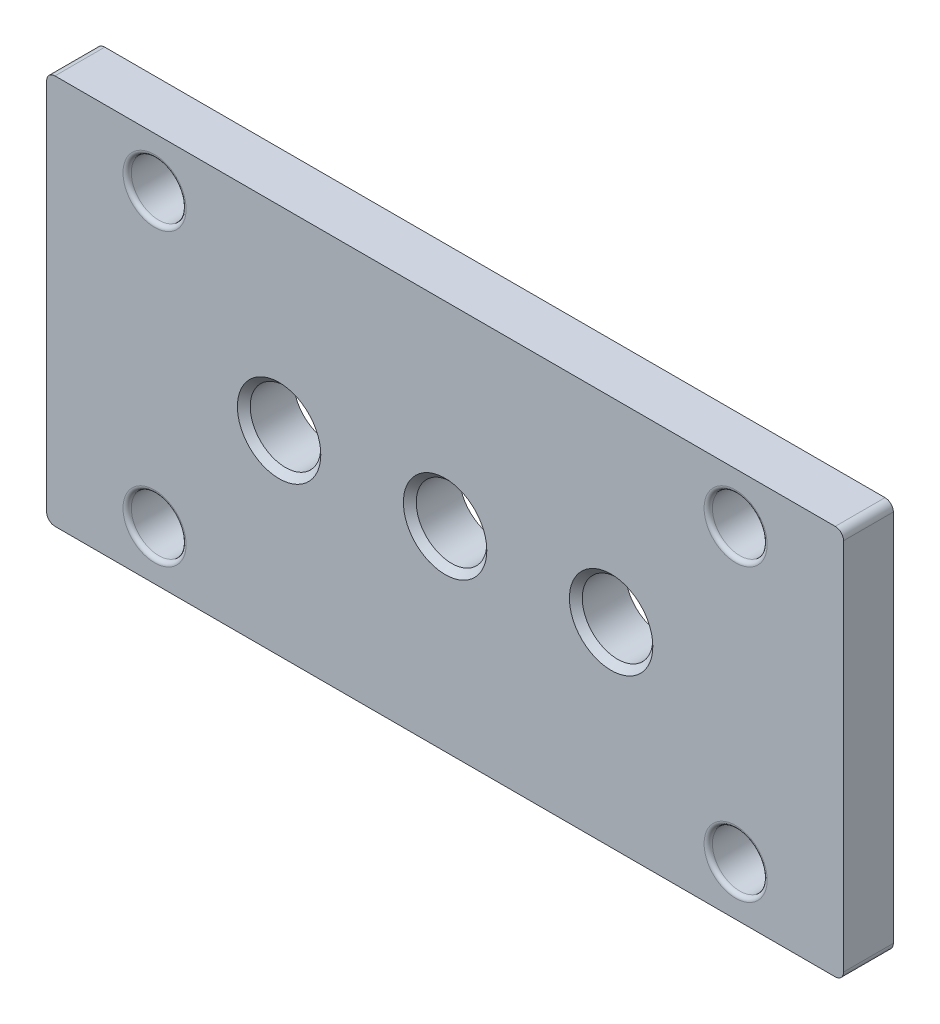
ISO-10303-21;
HEADER;
FILE_DESCRIPTION(('STEP AP214'),'2;1');
FILE_NAME('part.step','',(''),(''),'','','');
FILE_SCHEMA(('AUTOMOTIVE_DESIGN { 1 0 10303 214 1 1 1 1 }'));
ENDSEC;
DATA;
#1=APPLICATION_CONTEXT('core data for automotive mechanical design processes');
#2=APPLICATION_PROTOCOL_DEFINITION('international standard','automotive_design',2000,#1);
#3=PRODUCT_CONTEXT('',#1,'mechanical');
#4=PRODUCT('Part','Part','',(#3));
#5=PRODUCT_RELATED_PRODUCT_CATEGORY('part','',(#4));
#6=PRODUCT_DEFINITION_FORMATION('','',#4);
#7=PRODUCT_DEFINITION_CONTEXT('part definition',#1,'design');
#8=PRODUCT_DEFINITION('design','',#6,#7);
#9=PRODUCT_DEFINITION_SHAPE('','',#8);
#10=(LENGTH_UNIT() NAMED_UNIT(*) SI_UNIT(.MILLI.,.METRE.));
#11=(NAMED_UNIT(*) PLANE_ANGLE_UNIT() SI_UNIT($,.RADIAN.));
#12=(NAMED_UNIT(*) SI_UNIT($,.STERADIAN.) SOLID_ANGLE_UNIT());
#13=UNCERTAINTY_MEASURE_WITH_UNIT(LENGTH_MEASURE(1.E-05),#10,'distance_accuracy_value','');
#14=(GEOMETRIC_REPRESENTATION_CONTEXT(3) GLOBAL_UNCERTAINTY_ASSIGNED_CONTEXT((#13)) GLOBAL_UNIT_ASSIGNED_CONTEXT((#10,
#11,#12)) REPRESENTATION_CONTEXT('',''));
#15=CARTESIAN_POINT('',(0.,0.,0.));
#16=DIRECTION('',(0.,0.,1.));
#17=DIRECTION('',(1.,0.,0.));
#18=AXIS2_PLACEMENT_3D('',#15,#16,#17);
#19=CARTESIAN_POINT('',(0.,0.,6.));
#20=DIRECTION('',(0.,0.,-1.));
#21=DIRECTION('',(-1.,0.,0.));
#22=AXIS2_PLACEMENT_3D('',#19,#20,#21);
#23=PLANE('',#22);
#24=CARTESIAN_POINT('',(13.,-41.,6.));
#25=DIRECTION('',(0.,0.,-1.));
#26=DIRECTION('',(-1.,0.,0.));
#27=AXIS2_PLACEMENT_3D('',#24,#25,#26);
#28=CIRCLE('',#27,3.8);
#29=CARTESIAN_POINT('',(9.20000000000001,-41.,6.));
#30=VERTEX_POINT('',#29);
#31=EDGE_CURVE('E223',#30,#30,#28,.T.);
#32=ORIENTED_EDGE('',*,*,#31,.T.);
#33=EDGE_LOOP('',(#32));
#34=FACE_BOUND('',#33,.T.);
#35=CARTESIAN_POINT('',(83.,-41.,6.));
#36=DIRECTION('',(0.,0.,-1.));
#37=DIRECTION('',(-1.,0.,0.));
#38=AXIS2_PLACEMENT_3D('',#35,#36,#37);
#39=CIRCLE('',#38,3.79999999999999);
#40=CARTESIAN_POINT('',(79.2,-41.,6.));
#41=VERTEX_POINT('',#40);
#42=EDGE_CURVE('E219',#41,#41,#39,.T.);
#43=ORIENTED_EDGE('',*,*,#42,.T.);
#44=EDGE_LOOP('',(#43));
#45=FACE_BOUND('',#44,.T.);
#46=CARTESIAN_POINT('',(83.,-6.,6.));
#47=DIRECTION('',(0.,0.,-1.));
#48=DIRECTION('',(-1.,0.,0.));
#49=AXIS2_PLACEMENT_3D('',#46,#47,#48);
#50=CIRCLE('',#49,3.79999999999999);
#51=CARTESIAN_POINT('',(79.2,-6.,6.));
#52=VERTEX_POINT('',#51);
#53=EDGE_CURVE('E215',#52,#52,#50,.T.);
#54=ORIENTED_EDGE('',*,*,#53,.T.);
#55=EDGE_LOOP('',(#54));
#56=FACE_BOUND('',#55,.T.);
#57=CARTESIAN_POINT('',(13.,-6.00000000000001,6.));
#58=DIRECTION('',(0.,0.,-1.));
#59=DIRECTION('',(-1.,0.,0.));
#60=AXIS2_PLACEMENT_3D('',#57,#58,#59);
#61=CIRCLE('',#60,3.8);
#62=CARTESIAN_POINT('',(9.2,-6.00000000000001,6.));
#63=VERTEX_POINT('',#62);
#64=EDGE_CURVE('E211',#63,#63,#61,.T.);
#65=ORIENTED_EDGE('',*,*,#64,.T.);
#66=EDGE_LOOP('',(#65));
#67=FACE_BOUND('',#66,.T.);
#68=CARTESIAN_POINT('',(28.,-23.5,6.));
#69=DIRECTION('',(0.,0.,1.));
#70=DIRECTION('',(1.,0.,0.));
#71=AXIS2_PLACEMENT_3D('',#68,#69,#70);
#72=CIRCLE('',#71,5.025);
#73=CARTESIAN_POINT('',(33.025,-23.5,6.));
#74=VERTEX_POINT('',#73);
#75=EDGE_CURVE('E207',#74,#74,#72,.T.);
#76=ORIENTED_EDGE('',*,*,#75,.F.);
#77=EDGE_LOOP('',(#76));
#78=FACE_BOUND('',#77,.T.);
#79=CARTESIAN_POINT('',(48.,-23.5,6.));
#80=DIRECTION('',(0.,0.,1.));
#81=DIRECTION('',(1.,0.,0.));
#82=AXIS2_PLACEMENT_3D('',#79,#80,#81);
#83=CIRCLE('',#82,5.025);
#84=CARTESIAN_POINT('',(53.025,-23.5,6.));
#85=VERTEX_POINT('',#84);
#86=EDGE_CURVE('E391',#85,#85,#83,.T.);
#87=ORIENTED_EDGE('',*,*,#86,.F.);
#88=EDGE_LOOP('',(#87));
#89=FACE_BOUND('',#88,.T.);
#90=CARTESIAN_POINT('',(68.,-23.5,6.));
#91=DIRECTION('',(0.,0.,1.));
#92=DIRECTION('',(1.,0.,0.));
#93=AXIS2_PLACEMENT_3D('',#90,#91,#92);
#94=CIRCLE('',#93,5.025);
#95=CARTESIAN_POINT('',(73.025,-23.5,6.));
#96=VERTEX_POINT('',#95);
#97=EDGE_CURVE('E347',#96,#96,#94,.T.);
#98=ORIENTED_EDGE('',*,*,#97,.F.);
#99=EDGE_LOOP('',(#98));
#100=FACE_BOUND('',#99,.T.);
#101=DIRECTION('',(1.,0.,0.));
#102=VECTOR('',#101,1.);
#103=CARTESIAN_POINT('',(96.,-47.,6.));
#104=LINE('',#103,#102);
#105=CARTESIAN_POINT('',(1.00000000000003,-47.,6.));
#106=VERTEX_POINT('',#105);
#107=CARTESIAN_POINT('',(95.,-47.,6.));
#108=VERTEX_POINT('',#107);
#109=EDGE_CURVE('E368',#106,#108,#104,.T.);
#110=ORIENTED_EDGE('',*,*,#109,.T.);
#111=CARTESIAN_POINT('',(95.,-46.,6.));
#112=DIRECTION('',(0.,0.,-1.));
#113=DIRECTION('',(-1.,0.,0.));
#114=AXIS2_PLACEMENT_3D('',#111,#112,#113);
#115=CIRCLE('',#114,1.);
#116=CARTESIAN_POINT('',(96.,-46.,6.));
#117=VERTEX_POINT('',#116);
#118=EDGE_CURVE('E175',#108,#117,#115,.F.);
#119=ORIENTED_EDGE('',*,*,#118,.T.);
#120=DIRECTION('',(0.,1.,0.));
#121=VECTOR('',#120,1.);
#122=CARTESIAN_POINT('',(96.,0.,6.));
#123=LINE('',#122,#121);
#124=CARTESIAN_POINT('',(96.,-1.,6.));
#125=VERTEX_POINT('',#124);
#126=EDGE_CURVE('E130',#117,#125,#123,.T.);
#127=ORIENTED_EDGE('',*,*,#126,.T.);
#128=CARTESIAN_POINT('',(95.,-1.,6.));
#129=DIRECTION('',(0.,0.,-1.));
#130=DIRECTION('',(-1.,0.,0.));
#131=AXIS2_PLACEMENT_3D('',#128,#129,#130);
#132=CIRCLE('',#131,1.);
#133=CARTESIAN_POINT('',(95.,0.,6.));
#134=VERTEX_POINT('',#133);
#135=EDGE_CURVE('E65',#125,#134,#132,.F.);
#136=ORIENTED_EDGE('',*,*,#135,.T.);
#137=DIRECTION('',(-1.,0.,0.));
#138=VECTOR('',#137,1.);
#139=CARTESIAN_POINT('',(0.,0.,6.));
#140=LINE('',#139,#138);
#141=CARTESIAN_POINT('',(1.,0.,6.));
#142=VERTEX_POINT('',#141);
#143=EDGE_CURVE('E153',#134,#142,#140,.T.);
#144=ORIENTED_EDGE('',*,*,#143,.T.);
#145=CARTESIAN_POINT('',(1.,-1.,6.));
#146=DIRECTION('',(0.,0.,-1.));
#147=DIRECTION('',(-1.,0.,0.));
#148=AXIS2_PLACEMENT_3D('',#145,#146,#147);
#149=CIRCLE('',#148,1.);
#150=CARTESIAN_POINT('',(0.,-1.,6.));
#151=VERTEX_POINT('',#150);
#152=EDGE_CURVE('E169',#142,#151,#149,.F.);
#153=ORIENTED_EDGE('',*,*,#152,.T.);
#154=DIRECTION('',(0.,-1.,0.));
#155=VECTOR('',#154,1.);
#156=CARTESIAN_POINT('',(0.,-47.,6.));
#157=LINE('',#156,#155);
#158=CARTESIAN_POINT('',(0.,-46.,6.));
#159=VERTEX_POINT('',#158);
#160=EDGE_CURVE('E145',#151,#159,#157,.T.);
#161=ORIENTED_EDGE('',*,*,#160,.T.);
#162=CARTESIAN_POINT('',(1.,-46.,6.));
#163=DIRECTION('',(0.,0.,-1.));
#164=DIRECTION('',(-1.,0.,0.));
#165=AXIS2_PLACEMENT_3D('',#162,#163,#164);
#166=CIRCLE('',#165,1.);
#167=EDGE_CURVE('E172',#159,#106,#166,.F.);
#168=ORIENTED_EDGE('',*,*,#167,.T.);
#169=EDGE_LOOP('',(#110,#119,#127,#136,#144,#153,#161,#168));
#170=FACE_BOUND('',#169,.T.);
#171=ADVANCED_FACE('F42',(#34,#45,#56,#67,#78,#89,#100,#170),#23,.F.);
#172=CARTESIAN_POINT('',(0.,0.,0.));
#173=DIRECTION('',(0.,0.,-1.));
#174=DIRECTION('',(-1.,0.,0.));
#175=AXIS2_PLACEMENT_3D('',#172,#173,#174);
#176=PLANE('',#175);
#177=CARTESIAN_POINT('',(83.,-41.,0.));
#178=DIRECTION('',(0.,0.,-1.));
#179=DIRECTION('',(-1.,0.,0.));
#180=AXIS2_PLACEMENT_3D('',#177,#178,#179);
#181=CIRCLE('',#180,3.29999999999999);
#182=CARTESIAN_POINT('',(79.7,-41.,0.));
#183=VERTEX_POINT('',#182);
#184=EDGE_CURVE('E195',#183,#183,#181,.F.);
#185=ORIENTED_EDGE('',*,*,#184,.T.);
#186=EDGE_LOOP('',(#185));
#187=FACE_BOUND('',#186,.T.);
#188=CARTESIAN_POINT('',(83.,-6.,0.));
#189=DIRECTION('',(0.,0.,-1.));
#190=DIRECTION('',(-1.,0.,0.));
#191=AXIS2_PLACEMENT_3D('',#188,#189,#190);
#192=CIRCLE('',#191,3.29999999999999);
#193=CARTESIAN_POINT('',(79.7,-6.,0.));
#194=VERTEX_POINT('',#193);
#195=EDGE_CURVE('E191',#194,#194,#192,.T.);
#196=ORIENTED_EDGE('',*,*,#195,.F.);
#197=EDGE_LOOP('',(#196));
#198=FACE_BOUND('',#197,.T.);
#199=CARTESIAN_POINT('',(28.,-23.5,0.));
#200=DIRECTION('',(0.,0.,1.));
#201=DIRECTION('',(1.,0.,0.));
#202=AXIS2_PLACEMENT_3D('',#199,#200,#201);
#203=CIRCLE('',#202,4.25);
#204=CARTESIAN_POINT('',(32.25,-23.5,0.));
#205=VERTEX_POINT('',#204);
#206=EDGE_CURVE('E389',#205,#205,#203,.T.);
#207=ORIENTED_EDGE('',*,*,#206,.T.);
#208=EDGE_LOOP('',(#207));
#209=FACE_BOUND('',#208,.T.);
#210=CARTESIAN_POINT('',(48.,-23.5,0.));
#211=DIRECTION('',(0.,0.,1.));
#212=DIRECTION('',(1.,0.,0.));
#213=AXIS2_PLACEMENT_3D('',#210,#211,#212);
#214=CIRCLE('',#213,4.25);
#215=CARTESIAN_POINT('',(52.25,-23.5,0.));
#216=VERTEX_POINT('',#215);
#217=EDGE_CURVE('E350',#216,#216,#214,.T.);
#218=ORIENTED_EDGE('',*,*,#217,.T.);
#219=EDGE_LOOP('',(#218));
#220=FACE_BOUND('',#219,.T.);
#221=CARTESIAN_POINT('',(68.,-23.5,0.));
#222=DIRECTION('',(0.,0.,1.));
#223=DIRECTION('',(1.,0.,0.));
#224=AXIS2_PLACEMENT_3D('',#221,#222,#223);
#225=CIRCLE('',#224,4.25);
#226=CARTESIAN_POINT('',(72.25,-23.5,0.));
#227=VERTEX_POINT('',#226);
#228=EDGE_CURVE('E354',#227,#227,#225,.T.);
#229=ORIENTED_EDGE('',*,*,#228,.T.);
#230=EDGE_LOOP('',(#229));
#231=FACE_BOUND('',#230,.T.);
#232=DIRECTION('',(0.,1.,0.));
#233=VECTOR('',#232,1.);
#234=CARTESIAN_POINT('',(96.,0.,0.));
#235=LINE('',#234,#233);
#236=CARTESIAN_POINT('',(96.,-46.,0.));
#237=VERTEX_POINT('',#236);
#238=CARTESIAN_POINT('',(96.,-1.,0.));
#239=VERTEX_POINT('',#238);
#240=EDGE_CURVE('E128',#237,#239,#235,.T.);
#241=ORIENTED_EDGE('',*,*,#240,.F.);
#242=CARTESIAN_POINT('',(95.,-46.,0.));
#243=DIRECTION('',(0.,0.,-1.));
#244=DIRECTION('',(-1.,0.,0.));
#245=AXIS2_PLACEMENT_3D('',#242,#243,#244);
#246=CIRCLE('',#245,1.);
#247=CARTESIAN_POINT('',(95.,-47.,0.));
#248=VERTEX_POINT('',#247);
#249=EDGE_CURVE('E110',#237,#248,#246,.T.);
#250=ORIENTED_EDGE('',*,*,#249,.T.);
#251=DIRECTION('',(1.,0.,0.));
#252=VECTOR('',#251,1.);
#253=CARTESIAN_POINT('',(96.,-47.,0.));
#254=LINE('',#253,#252);
#255=CARTESIAN_POINT('',(1.00000000000003,-47.,0.));
#256=VERTEX_POINT('',#255);
#257=EDGE_CURVE('E140',#256,#248,#254,.T.);
#258=ORIENTED_EDGE('',*,*,#257,.F.);
#259=CARTESIAN_POINT('',(1.,-46.,0.));
#260=DIRECTION('',(0.,0.,-1.));
#261=DIRECTION('',(-1.,0.,0.));
#262=AXIS2_PLACEMENT_3D('',#259,#260,#261);
#263=CIRCLE('',#262,1.);
#264=CARTESIAN_POINT('',(0.,-46.,0.));
#265=VERTEX_POINT('',#264);
#266=EDGE_CURVE('E122',#256,#265,#263,.T.);
#267=ORIENTED_EDGE('',*,*,#266,.T.);
#268=DIRECTION('',(0.,-1.,0.));
#269=VECTOR('',#268,1.);
#270=CARTESIAN_POINT('',(0.,-47.,0.));
#271=LINE('',#270,#269);
#272=CARTESIAN_POINT('',(0.,-1.,0.));
#273=VERTEX_POINT('',#272);
#274=EDGE_CURVE('E148',#273,#265,#271,.T.);
#275=ORIENTED_EDGE('',*,*,#274,.F.);
#276=CARTESIAN_POINT('',(1.,-1.,0.));
#277=DIRECTION('',(0.,0.,-1.));
#278=DIRECTION('',(-1.,0.,0.));
#279=AXIS2_PLACEMENT_3D('',#276,#277,#278);
#280=CIRCLE('',#279,1.);
#281=CARTESIAN_POINT('',(1.,0.,0.));
#282=VERTEX_POINT('',#281);
#283=EDGE_CURVE('E157',#273,#282,#280,.T.);
#284=ORIENTED_EDGE('',*,*,#283,.T.);
#285=DIRECTION('',(-1.,0.,0.));
#286=VECTOR('',#285,1.);
#287=CARTESIAN_POINT('',(0.,0.,0.));
#288=LINE('',#287,#286);
#289=CARTESIAN_POINT('',(95.,0.,0.));
#290=VERTEX_POINT('',#289);
#291=EDGE_CURVE('E139',#290,#282,#288,.T.);
#292=ORIENTED_EDGE('',*,*,#291,.F.);
#293=CARTESIAN_POINT('',(95.,-1.,0.));
#294=DIRECTION('',(0.,0.,-1.));
#295=DIRECTION('',(-1.,0.,0.));
#296=AXIS2_PLACEMENT_3D('',#293,#294,#295);
#297=CIRCLE('',#296,1.);
#298=EDGE_CURVE('E132',#290,#239,#297,.T.);
#299=ORIENTED_EDGE('',*,*,#298,.T.);
#300=EDGE_LOOP('',(#241,#250,#258,#267,#275,#284,#292,#299));
#301=FACE_BOUND('',#300,.T.);
#302=CARTESIAN_POINT('',(13.,-41.,0.));
#303=DIRECTION('',(0.,0.,-1.));
#304=DIRECTION('',(-1.,0.,0.));
#305=AXIS2_PLACEMENT_3D('',#302,#303,#304);
#306=CIRCLE('',#305,3.3);
#307=CARTESIAN_POINT('',(9.70000000000001,-41.,0.));
#308=VERTEX_POINT('',#307);
#309=EDGE_CURVE('E199',#308,#308,#306,.T.);
#310=ORIENTED_EDGE('',*,*,#309,.F.);
#311=EDGE_LOOP('',(#310));
#312=FACE_BOUND('',#311,.T.);
#313=CARTESIAN_POINT('',(13.,-6.00000000000001,0.));
#314=DIRECTION('',(0.,0.,-1.));
#315=DIRECTION('',(-1.,0.,0.));
#316=AXIS2_PLACEMENT_3D('',#313,#314,#315);
#317=CIRCLE('',#316,3.3);
#318=CARTESIAN_POINT('',(9.7,-6.00000000000001,0.));
#319=VERTEX_POINT('',#318);
#320=EDGE_CURVE('E203',#319,#319,#317,.F.);
#321=ORIENTED_EDGE('',*,*,#320,.T.);
#322=EDGE_LOOP('',(#321));
#323=FACE_BOUND('',#322,.T.);
#324=ADVANCED_FACE('F135',(#187,#198,#209,#220,#231,#301,#312,#323),#176,.T.);
#325=CARTESIAN_POINT('',(0.,-47.,6.));
#326=DIRECTION('',(1.,0.,0.));
#327=DIRECTION('',(0.,1.,0.));
#328=AXIS2_PLACEMENT_3D('',#325,#326,#327);
#329=PLANE('',#328);
#330=ORIENTED_EDGE('',*,*,#274,.T.);
#331=DIRECTION('',(0.,0.,-1.));
#332=VECTOR('',#331,1.);
#333=CARTESIAN_POINT('',(0.,-46.,6.));
#334=LINE('',#333,#332);
#335=EDGE_CURVE('E181',#265,#159,#334,.F.);
#336=ORIENTED_EDGE('',*,*,#335,.T.);
#337=ORIENTED_EDGE('',*,*,#160,.F.);
#338=DIRECTION('',(0.,0.,-1.));
#339=VECTOR('',#338,1.);
#340=CARTESIAN_POINT('',(0.,-1.,6.));
#341=LINE('',#340,#339);
#342=EDGE_CURVE('E177',#151,#273,#341,.T.);
#343=ORIENTED_EDGE('',*,*,#342,.T.);
#344=EDGE_LOOP('',(#330,#336,#337,#343));
#345=FACE_BOUND('',#344,.T.);
#346=ADVANCED_FACE('F256',(#345),#329,.F.);
#347=CARTESIAN_POINT('',(96.,-47.,6.));
#348=DIRECTION('',(0.,1.,0.));
#349=DIRECTION('',(-1.,0.,0.));
#350=AXIS2_PLACEMENT_3D('',#347,#348,#349);
#351=PLANE('',#350);
#352=ORIENTED_EDGE('',*,*,#257,.T.);
#353=DIRECTION('',(0.,0.,-1.));
#354=VECTOR('',#353,1.);
#355=CARTESIAN_POINT('',(95.,-47.,6.));
#356=LINE('',#355,#354);
#357=EDGE_CURVE('E115',#248,#108,#356,.F.);
#358=ORIENTED_EDGE('',*,*,#357,.T.);
#359=ORIENTED_EDGE('',*,*,#109,.F.);
#360=DIRECTION('',(0.,0.,-1.));
#361=VECTOR('',#360,1.);
#362=CARTESIAN_POINT('',(1.,-47.,6.));
#363=LINE('',#362,#361);
#364=EDGE_CURVE('E121',#106,#256,#363,.T.);
#365=ORIENTED_EDGE('',*,*,#364,.T.);
#366=EDGE_LOOP('',(#352,#358,#359,#365));
#367=FACE_BOUND('',#366,.T.);
#368=ADVANCED_FACE('F269',(#367),#351,.F.);
#369=CARTESIAN_POINT('',(96.,0.,6.));
#370=DIRECTION('',(-1.,0.,0.));
#371=DIRECTION('',(0.,-1.,0.));
#372=AXIS2_PLACEMENT_3D('',#369,#370,#371);
#373=PLANE('',#372);
#374=ORIENTED_EDGE('',*,*,#126,.F.);
#375=DIRECTION('',(0.,0.,-1.));
#376=VECTOR('',#375,1.);
#377=CARTESIAN_POINT('',(96.,-46.,6.));
#378=LINE('',#377,#376);
#379=EDGE_CURVE('E114',#117,#237,#378,.T.);
#380=ORIENTED_EDGE('',*,*,#379,.T.);
#381=ORIENTED_EDGE('',*,*,#240,.T.);
#382=DIRECTION('',(0.,0.,-1.));
#383=VECTOR('',#382,1.);
#384=CARTESIAN_POINT('',(96.,-1.,6.));
#385=LINE('',#384,#383);
#386=EDGE_CURVE('E133',#239,#125,#385,.F.);
#387=ORIENTED_EDGE('',*,*,#386,.T.);
#388=EDGE_LOOP('',(#374,#380,#381,#387));
#389=FACE_BOUND('',#388,.T.);
#390=ADVANCED_FACE('F127',(#389),#373,.F.);
#391=CARTESIAN_POINT('',(0.,0.,6.));
#392=DIRECTION('',(0.,-1.,0.));
#393=DIRECTION('',(0.,0.,-1.));
#394=AXIS2_PLACEMENT_3D('',#391,#392,#393);
#395=PLANE('',#394);
#396=ORIENTED_EDGE('',*,*,#291,.T.);
#397=DIRECTION('',(0.,0.,-1.));
#398=VECTOR('',#397,1.);
#399=CARTESIAN_POINT('',(1.,0.,6.));
#400=LINE('',#399,#398);
#401=EDGE_CURVE('E58',#282,#142,#400,.F.);
#402=ORIENTED_EDGE('',*,*,#401,.T.);
#403=ORIENTED_EDGE('',*,*,#143,.F.);
#404=DIRECTION('',(0.,0.,-1.));
#405=VECTOR('',#404,1.);
#406=CARTESIAN_POINT('',(95.,0.,6.));
#407=LINE('',#406,#405);
#408=EDGE_CURVE('E184',#134,#290,#407,.T.);
#409=ORIENTED_EDGE('',*,*,#408,.T.);
#410=EDGE_LOOP('',(#396,#402,#403,#409));
#411=FACE_BOUND('',#410,.T.);
#412=ADVANCED_FACE('F264',(#411),#395,.F.);
#413=CARTESIAN_POINT('',(95.,-46.,6.));
#414=DIRECTION('',(0.,0.,-1.));
#415=DIRECTION('',(-1.,0.,0.));
#416=AXIS2_PLACEMENT_3D('',#413,#414,#415);
#417=CYLINDRICAL_SURFACE('',#416,1.);
#418=ORIENTED_EDGE('',*,*,#118,.F.);
#419=ORIENTED_EDGE('',*,*,#357,.F.);
#420=ORIENTED_EDGE('',*,*,#249,.F.);
#421=ORIENTED_EDGE('',*,*,#379,.F.);
#422=EDGE_LOOP('',(#418,#419,#420,#421));
#423=FACE_BOUND('',#422,.T.);
#424=ADVANCED_FACE('F113',(#423),#417,.T.);
#425=CARTESIAN_POINT('',(1.,-46.,6.));
#426=DIRECTION('',(0.,0.,-1.));
#427=DIRECTION('',(-1.,0.,0.));
#428=AXIS2_PLACEMENT_3D('',#425,#426,#427);
#429=CYLINDRICAL_SURFACE('',#428,1.);
#430=ORIENTED_EDGE('',*,*,#167,.F.);
#431=ORIENTED_EDGE('',*,*,#335,.F.);
#432=ORIENTED_EDGE('',*,*,#266,.F.);
#433=ORIENTED_EDGE('',*,*,#364,.F.);
#434=EDGE_LOOP('',(#430,#431,#432,#433));
#435=FACE_BOUND('',#434,.T.);
#436=ADVANCED_FACE('F278',(#435),#429,.T.);
#437=CARTESIAN_POINT('',(1.,-1.,6.));
#438=DIRECTION('',(0.,0.,-1.));
#439=DIRECTION('',(-1.,0.,0.));
#440=AXIS2_PLACEMENT_3D('',#437,#438,#439);
#441=CYLINDRICAL_SURFACE('',#440,1.);
#442=ORIENTED_EDGE('',*,*,#152,.F.);
#443=ORIENTED_EDGE('',*,*,#401,.F.);
#444=ORIENTED_EDGE('',*,*,#283,.F.);
#445=ORIENTED_EDGE('',*,*,#342,.F.);
#446=EDGE_LOOP('',(#442,#443,#444,#445));
#447=FACE_BOUND('',#446,.T.);
#448=ADVANCED_FACE('F281',(#447),#441,.T.);
#449=CARTESIAN_POINT('',(95.,-1.,6.));
#450=DIRECTION('',(0.,0.,-1.));
#451=DIRECTION('',(-1.,0.,0.));
#452=AXIS2_PLACEMENT_3D('',#449,#450,#451);
#453=CYLINDRICAL_SURFACE('',#452,1.);
#454=ORIENTED_EDGE('',*,*,#135,.F.);
#455=ORIENTED_EDGE('',*,*,#386,.F.);
#456=ORIENTED_EDGE('',*,*,#298,.F.);
#457=ORIENTED_EDGE('',*,*,#408,.F.);
#458=EDGE_LOOP('',(#454,#455,#456,#457));
#459=FACE_BOUND('',#458,.T.);
#460=ADVANCED_FACE('F285',(#459),#453,.T.);
#461=CARTESIAN_POINT('',(68.,-23.5,6.));
#462=DIRECTION('',(0.,0.,1.));
#463=DIRECTION('',(1.,0.,0.));
#464=AXIS2_PLACEMENT_3D('',#461,#462,#463);
#465=CYLINDRICAL_SURFACE('',#464,4.25);
#466=ORIENTED_EDGE('',*,*,#228,.F.);
#467=EDGE_LOOP('',(#466));
#468=FACE_BOUND('',#467,.T.);
#469=CARTESIAN_POINT('',(68.,-23.5,5.225));
#470=DIRECTION('',(0.,0.,1.));
#471=DIRECTION('',(1.,0.,0.));
#472=AXIS2_PLACEMENT_3D('',#469,#470,#471);
#473=CIRCLE('',#472,4.25);
#474=CARTESIAN_POINT('',(72.25,-23.5,5.225));
#475=VERTEX_POINT('',#474);
#476=EDGE_CURVE('E344',#475,#475,#473,.T.);
#477=ORIENTED_EDGE('',*,*,#476,.T.);
#478=EDGE_LOOP('',(#477));
#479=FACE_BOUND('',#478,.T.);
#480=ADVANCED_FACE('F261',(#468,#479),#465,.F.);
#481=CARTESIAN_POINT('',(68.,-23.5,6.));
#482=DIRECTION('',(0.,0.,1.));
#483=DIRECTION('',(1.,0.,0.));
#484=AXIS2_PLACEMENT_3D('',#481,#482,#483);
#485=CONICAL_SURFACE('',#484,5.025,0.785398163397446);
#486=ORIENTED_EDGE('',*,*,#476,.F.);
#487=EDGE_LOOP('',(#486));
#488=FACE_BOUND('',#487,.T.);
#489=ORIENTED_EDGE('',*,*,#97,.T.);
#490=EDGE_LOOP('',(#489));
#491=FACE_BOUND('',#490,.T.);
#492=ADVANCED_FACE('F333',(#488,#491),#485,.F.);
#493=CARTESIAN_POINT('',(48.,-23.5,6.));
#494=DIRECTION('',(0.,0.,1.));
#495=DIRECTION('',(1.,0.,0.));
#496=AXIS2_PLACEMENT_3D('',#493,#494,#495);
#497=CYLINDRICAL_SURFACE('',#496,4.25);
#498=ORIENTED_EDGE('',*,*,#217,.F.);
#499=EDGE_LOOP('',(#498));
#500=FACE_BOUND('',#499,.T.);
#501=CARTESIAN_POINT('',(48.,-23.5,5.225));
#502=DIRECTION('',(0.,0.,1.));
#503=DIRECTION('',(1.,0.,0.));
#504=AXIS2_PLACEMENT_3D('',#501,#502,#503);
#505=CIRCLE('',#504,4.25);
#506=CARTESIAN_POINT('',(52.25,-23.5,5.225));
#507=VERTEX_POINT('',#506);
#508=EDGE_CURVE('E358',#507,#507,#505,.T.);
#509=ORIENTED_EDGE('',*,*,#508,.T.);
#510=EDGE_LOOP('',(#509));
#511=FACE_BOUND('',#510,.T.);
#512=ADVANCED_FACE('F330',(#500,#511),#497,.F.);
#513=CARTESIAN_POINT('',(48.,-23.5,6.));
#514=DIRECTION('',(0.,0.,1.));
#515=DIRECTION('',(1.,0.,0.));
#516=AXIS2_PLACEMENT_3D('',#513,#514,#515);
#517=CONICAL_SURFACE('',#516,5.025,0.78539816339745);
#518=ORIENTED_EDGE('',*,*,#508,.F.);
#519=EDGE_LOOP('',(#518));
#520=FACE_BOUND('',#519,.T.);
#521=ORIENTED_EDGE('',*,*,#86,.T.);
#522=EDGE_LOOP('',(#521));
#523=FACE_BOUND('',#522,.T.);
#524=ADVANCED_FACE('F326',(#520,#523),#517,.F.);
#525=CARTESIAN_POINT('',(28.,-23.5,6.));
#526=DIRECTION('',(0.,0.,1.));
#527=DIRECTION('',(1.,0.,0.));
#528=AXIS2_PLACEMENT_3D('',#525,#526,#527);
#529=CYLINDRICAL_SURFACE('',#528,4.25);
#530=ORIENTED_EDGE('',*,*,#206,.F.);
#531=EDGE_LOOP('',(#530));
#532=FACE_BOUND('',#531,.T.);
#533=CARTESIAN_POINT('',(28.,-23.5,5.225));
#534=DIRECTION('',(0.,0.,1.));
#535=DIRECTION('',(1.,0.,0.));
#536=AXIS2_PLACEMENT_3D('',#533,#534,#535);
#537=CIRCLE('',#536,4.25);
#538=CARTESIAN_POINT('',(32.25,-23.5,5.225));
#539=VERTEX_POINT('',#538);
#540=EDGE_CURVE('E387',#539,#539,#537,.T.);
#541=ORIENTED_EDGE('',*,*,#540,.T.);
#542=EDGE_LOOP('',(#541));
#543=FACE_BOUND('',#542,.T.);
#544=ADVANCED_FACE('F322',(#532,#543),#529,.F.);
#545=CARTESIAN_POINT('',(28.,-23.5,6.));
#546=DIRECTION('',(0.,0.,1.));
#547=DIRECTION('',(1.,0.,0.));
#548=AXIS2_PLACEMENT_3D('',#545,#546,#547);
#549=CONICAL_SURFACE('',#548,5.025,0.785398163397446);
#550=ORIENTED_EDGE('',*,*,#540,.F.);
#551=EDGE_LOOP('',(#550));
#552=FACE_BOUND('',#551,.T.);
#553=ORIENTED_EDGE('',*,*,#75,.T.);
#554=EDGE_LOOP('',(#553));
#555=FACE_BOUND('',#554,.T.);
#556=ADVANCED_FACE('F319',(#552,#555),#549,.F.);
#557=CARTESIAN_POINT('',(83.,-6.,-4.));
#558=DIRECTION('',(0.,0.,1.));
#559=DIRECTION('',(1.,0.,0.));
#560=AXIS2_PLACEMENT_3D('',#557,#558,#559);
#561=CYLINDRICAL_SURFACE('',#560,3.29999999999999);
#562=CARTESIAN_POINT('',(83.,-6.,5.5));
#563=DIRECTION('',(0.,0.,-1.));
#564=DIRECTION('',(-1.,0.,0.));
#565=AXIS2_PLACEMENT_3D('',#562,#563,#564);
#566=CIRCLE('',#565,3.29999999999999);
#567=CARTESIAN_POINT('',(79.7,-6.,5.5));
#568=VERTEX_POINT('',#567);
#569=EDGE_CURVE('E51',#568,#568,#566,.F.);
#570=ORIENTED_EDGE('',*,*,#569,.T.);
#571=EDGE_LOOP('',(#570));
#572=FACE_BOUND('',#571,.T.);
#573=ORIENTED_EDGE('',*,*,#195,.T.);
#574=EDGE_LOOP('',(#573));
#575=FACE_BOUND('',#574,.T.);
#576=ADVANCED_FACE('F234',(#572,#575),#561,.F.);
#577=CARTESIAN_POINT('',(83.,-41.,-4.));
#578=DIRECTION('',(0.,0.,1.));
#579=DIRECTION('',(1.,0.,0.));
#580=AXIS2_PLACEMENT_3D('',#577,#578,#579);
#581=CYLINDRICAL_SURFACE('',#580,3.29999999999999);
#582=CARTESIAN_POINT('',(83.,-41.,5.5));
#583=DIRECTION('',(0.,0.,-1.));
#584=DIRECTION('',(-1.,0.,0.));
#585=AXIS2_PLACEMENT_3D('',#582,#583,#584);
#586=CIRCLE('',#585,3.29999999999999);
#587=CARTESIAN_POINT('',(79.7,-41.,5.5));
#588=VERTEX_POINT('',#587);
#589=EDGE_CURVE('E227',#588,#588,#586,.F.);
#590=ORIENTED_EDGE('',*,*,#589,.T.);
#591=EDGE_LOOP('',(#590));
#592=FACE_BOUND('',#591,.T.);
#593=ORIENTED_EDGE('',*,*,#184,.F.);
#594=EDGE_LOOP('',(#593));
#595=FACE_BOUND('',#594,.T.);
#596=ADVANCED_FACE('F305',(#592,#595),#581,.F.);
#597=CARTESIAN_POINT('',(13.,-41.,-4.));
#598=DIRECTION('',(0.,0.,1.));
#599=DIRECTION('',(1.,0.,0.));
#600=AXIS2_PLACEMENT_3D('',#597,#598,#599);
#601=CYLINDRICAL_SURFACE('',#600,3.3);
#602=CARTESIAN_POINT('',(13.,-41.,5.5));
#603=DIRECTION('',(0.,0.,-1.));
#604=DIRECTION('',(-1.,0.,0.));
#605=AXIS2_PLACEMENT_3D('',#602,#603,#604);
#606=CIRCLE('',#605,3.3);
#607=CARTESIAN_POINT('',(9.70000000000001,-41.,5.5));
#608=VERTEX_POINT('',#607);
#609=EDGE_CURVE('E190',#608,#608,#606,.F.);
#610=ORIENTED_EDGE('',*,*,#609,.T.);
#611=EDGE_LOOP('',(#610));
#612=FACE_BOUND('',#611,.T.);
#613=ORIENTED_EDGE('',*,*,#309,.T.);
#614=EDGE_LOOP('',(#613));
#615=FACE_BOUND('',#614,.T.);
#616=ADVANCED_FACE('F296',(#612,#615),#601,.F.);
#617=CARTESIAN_POINT('',(13.,-6.00000000000001,-4.));
#618=DIRECTION('',(0.,0.,1.));
#619=DIRECTION('',(1.,0.,0.));
#620=AXIS2_PLACEMENT_3D('',#617,#618,#619);
#621=CYLINDRICAL_SURFACE('',#620,3.3);
#622=CARTESIAN_POINT('',(13.,-6.00000000000001,5.5));
#623=DIRECTION('',(0.,0.,-1.));
#624=DIRECTION('',(-1.,0.,0.));
#625=AXIS2_PLACEMENT_3D('',#622,#623,#624);
#626=CIRCLE('',#625,3.3);
#627=CARTESIAN_POINT('',(9.7,-6.00000000000001,5.5));
#628=VERTEX_POINT('',#627);
#629=EDGE_CURVE('E11',#628,#628,#626,.F.);
#630=ORIENTED_EDGE('',*,*,#629,.T.);
#631=EDGE_LOOP('',(#630));
#632=FACE_BOUND('',#631,.T.);
#633=ORIENTED_EDGE('',*,*,#320,.F.);
#634=EDGE_LOOP('',(#633));
#635=FACE_BOUND('',#634,.T.);
#636=ADVANCED_FACE('F291',(#632,#635),#621,.F.);
#637=CARTESIAN_POINT('',(13.,-41.,5.5));
#638=DIRECTION('',(0.,0.,-1.));
#639=DIRECTION('',(-1.,0.,0.));
#640=AXIS2_PLACEMENT_3D('',#637,#638,#639);
#641=TOROIDAL_SURFACE('',#640,3.8,0.5);
#642=ORIENTED_EDGE('',*,*,#31,.F.);
#643=EDGE_LOOP('',(#642));
#644=FACE_BOUND('',#643,.T.);
#645=ORIENTED_EDGE('',*,*,#609,.F.);
#646=EDGE_LOOP('',(#645));
#647=FACE_BOUND('',#646,.T.);
#648=ADVANCED_FACE('F246',(#644,#647),#641,.T.);
#649=CARTESIAN_POINT('',(83.,-41.,5.5));
#650=DIRECTION('',(0.,0.,-1.));
#651=DIRECTION('',(-1.,0.,0.));
#652=AXIS2_PLACEMENT_3D('',#649,#650,#651);
#653=TOROIDAL_SURFACE('',#652,3.79999999999999,0.5);
#654=ORIENTED_EDGE('',*,*,#589,.F.);
#655=EDGE_LOOP('',(#654));
#656=FACE_BOUND('',#655,.T.);
#657=ORIENTED_EDGE('',*,*,#42,.F.);
#658=EDGE_LOOP('',(#657));
#659=FACE_BOUND('',#658,.T.);
#660=ADVANCED_FACE('F239',(#656,#659),#653,.T.);
#661=CARTESIAN_POINT('',(83.,-6.,5.5));
#662=DIRECTION('',(0.,0.,-1.));
#663=DIRECTION('',(-1.,0.,0.));
#664=AXIS2_PLACEMENT_3D('',#661,#662,#663);
#665=TOROIDAL_SURFACE('',#664,3.79999999999999,0.5);
#666=ORIENTED_EDGE('',*,*,#53,.F.);
#667=EDGE_LOOP('',(#666));
#668=FACE_BOUND('',#667,.T.);
#669=ORIENTED_EDGE('',*,*,#569,.F.);
#670=EDGE_LOOP('',(#669));
#671=FACE_BOUND('',#670,.T.);
#672=ADVANCED_FACE('F237',(#668,#671),#665,.T.);
#673=CARTESIAN_POINT('',(13.,-6.00000000000001,5.5));
#674=DIRECTION('',(0.,0.,-1.));
#675=DIRECTION('',(-1.,0.,0.));
#676=AXIS2_PLACEMENT_3D('',#673,#674,#675);
#677=TOROIDAL_SURFACE('',#676,3.8,0.5);
#678=ORIENTED_EDGE('',*,*,#629,.F.);
#679=EDGE_LOOP('',(#678));
#680=FACE_BOUND('',#679,.T.);
#681=ORIENTED_EDGE('',*,*,#64,.F.);
#682=EDGE_LOOP('',(#681));
#683=FACE_BOUND('',#682,.T.);
#684=ADVANCED_FACE('F44',(#680,#683),#677,.T.);
#685=CLOSED_SHELL('',(#171,#324,#346,#368,#390,#412,#424,#436,#448,#460,#480,#492,#512,#524,
#544,#556,#576,#596,#616,#636,#648,#660,#672,#684));
#686=MANIFOLD_SOLID_BREP('B2',#685);
#687=ADVANCED_BREP_SHAPE_REPRESENTATION('',(#18,#686),#14);
#688=SHAPE_DEFINITION_REPRESENTATION(#9,#687);
ENDSEC;
END-ISO-10303-21;
